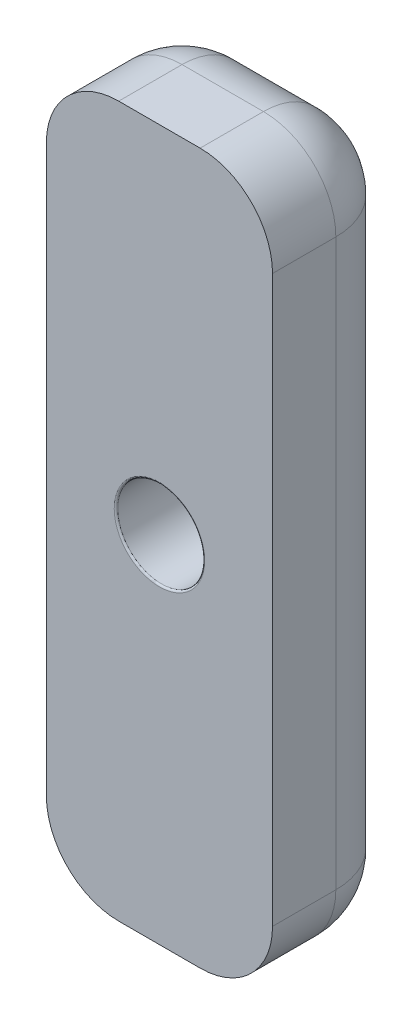
ISO-10303-21;
HEADER;
FILE_DESCRIPTION(('STEP AP214'),'2;1');
FILE_NAME('part.step','',(''),(''),'','','');
FILE_SCHEMA(('AUTOMOTIVE_DESIGN { 1 0 10303 214 1 1 1 1 }'));
ENDSEC;
DATA;
#1=APPLICATION_CONTEXT('core data for automotive mechanical design processes');
#2=APPLICATION_PROTOCOL_DEFINITION('international standard','automotive_design',2000,#1);
#3=PRODUCT_CONTEXT('',#1,'mechanical');
#4=PRODUCT('Part','Part','',(#3));
#5=PRODUCT_RELATED_PRODUCT_CATEGORY('part','',(#4));
#6=PRODUCT_DEFINITION_FORMATION('','',#4);
#7=PRODUCT_DEFINITION_CONTEXT('part definition',#1,'design');
#8=PRODUCT_DEFINITION('design','',#6,#7);
#9=PRODUCT_DEFINITION_SHAPE('','',#8);
#10=(LENGTH_UNIT() NAMED_UNIT(*) SI_UNIT(.MILLI.,.METRE.));
#11=(NAMED_UNIT(*) PLANE_ANGLE_UNIT() SI_UNIT($,.RADIAN.));
#12=(NAMED_UNIT(*) SI_UNIT($,.STERADIAN.) SOLID_ANGLE_UNIT());
#13=UNCERTAINTY_MEASURE_WITH_UNIT(LENGTH_MEASURE(1.E-05),#10,'distance_accuracy_value','');
#14=(GEOMETRIC_REPRESENTATION_CONTEXT(3) GLOBAL_UNCERTAINTY_ASSIGNED_CONTEXT((#13)) GLOBAL_UNIT_ASSIGNED_CONTEXT((#10,
#11,#12)) REPRESENTATION_CONTEXT('',''));
#15=CARTESIAN_POINT('',(0.,0.,0.));
#16=DIRECTION('',(0.,0.,1.));
#17=DIRECTION('',(1.,0.,0.));
#18=AXIS2_PLACEMENT_3D('',#15,#16,#17);
#19=CARTESIAN_POINT('',(12.5,39.25,15.));
#20=DIRECTION('',(0.,-1.,0.));
#21=DIRECTION('',(1.,0.,0.));
#22=AXIS2_PLACEMENT_3D('',#19,#20,#21);
#23=PLANE('',#22);
#24=DIRECTION('',(0.,0.,-1.));
#25=VECTOR('',#24,1.);
#26=CARTESIAN_POINT('',(4.5,39.25,15.));
#27=LINE('',#26,#25);
#28=CARTESIAN_POINT('',(4.5,39.25,15.));
#29=VERTEX_POINT('',#28);
#30=CARTESIAN_POINT('',(4.5,39.25,8.));
#31=VERTEX_POINT('',#30);
#32=EDGE_CURVE('E159',#29,#31,#27,.T.);
#33=ORIENTED_EDGE('',*,*,#32,.T.);
#34=DIRECTION('',(-1.,0.,0.));
#35=VECTOR('',#34,1.);
#36=CARTESIAN_POINT('',(-4.5,39.25,8.));
#37=LINE('',#36,#35);
#38=CARTESIAN_POINT('',(-4.5,39.25,8.));
#39=VERTEX_POINT('',#38);
#40=EDGE_CURVE('E180',#31,#39,#37,.T.);
#41=ORIENTED_EDGE('',*,*,#40,.T.);
#42=DIRECTION('',(0.,0.,-1.));
#43=VECTOR('',#42,1.);
#44=CARTESIAN_POINT('',(-4.5,39.25,15.));
#45=LINE('',#44,#43);
#46=CARTESIAN_POINT('',(-4.5,39.25,15.));
#47=VERTEX_POINT('',#46);
#48=EDGE_CURVE('E158',#39,#47,#45,.F.);
#49=ORIENTED_EDGE('',*,*,#48,.T.);
#50=DIRECTION('',(-1.,0.,0.));
#51=VECTOR('',#50,1.);
#52=CARTESIAN_POINT('',(12.5,39.25,15.));
#53=LINE('',#52,#51);
#54=EDGE_CURVE('E215',#29,#47,#53,.T.);
#55=ORIENTED_EDGE('',*,*,#54,.F.);
#56=EDGE_LOOP('',(#33,#41,#49,#55));
#57=FACE_BOUND('',#56,.T.);
#58=ADVANCED_FACE('F41',(#57),#23,.F.);
#59=CARTESIAN_POINT('',(-12.5,-39.25,15.));
#60=DIRECTION('',(1.,0.,0.));
#61=DIRECTION('',(0.,1.,0.));
#62=AXIS2_PLACEMENT_3D('',#59,#60,#61);
#63=PLANE('',#62);
#64=DIRECTION('',(0.,0.,-1.));
#65=VECTOR('',#64,1.);
#66=CARTESIAN_POINT('',(-12.5,31.25,15.));
#67=LINE('',#66,#65);
#68=CARTESIAN_POINT('',(-12.5,31.25,15.));
#69=VERTEX_POINT('',#68);
#70=CARTESIAN_POINT('',(-12.5,31.25,8.));
#71=VERTEX_POINT('',#70);
#72=EDGE_CURVE('E136',#69,#71,#67,.T.);
#73=ORIENTED_EDGE('',*,*,#72,.T.);
#74=DIRECTION('',(0.,-1.,0.));
#75=VECTOR('',#74,1.);
#76=CARTESIAN_POINT('',(-12.5,-31.25,8.));
#77=LINE('',#76,#75);
#78=CARTESIAN_POINT('',(-12.5,-31.25,8.));
#79=VERTEX_POINT('',#78);
#80=EDGE_CURVE('E64',#71,#79,#77,.T.);
#81=ORIENTED_EDGE('',*,*,#80,.T.);
#82=DIRECTION('',(0.,0.,-1.));
#83=VECTOR('',#82,1.);
#84=CARTESIAN_POINT('',(-12.5,-31.25,15.));
#85=LINE('',#84,#83);
#86=CARTESIAN_POINT('',(-12.5,-31.25,15.));
#87=VERTEX_POINT('',#86);
#88=EDGE_CURVE('E142',#79,#87,#85,.F.);
#89=ORIENTED_EDGE('',*,*,#88,.T.);
#90=DIRECTION('',(0.,-1.,0.));
#91=VECTOR('',#90,1.);
#92=CARTESIAN_POINT('',(-12.5,-39.25,15.));
#93=LINE('',#92,#91);
#94=EDGE_CURVE('E130',#69,#87,#93,.T.);
#95=ORIENTED_EDGE('',*,*,#94,.F.);
#96=EDGE_LOOP('',(#73,#81,#89,#95));
#97=FACE_BOUND('',#96,.T.);
#98=ADVANCED_FACE('F250',(#97),#63,.F.);
#99=CARTESIAN_POINT('',(12.5,-39.25,15.));
#100=DIRECTION('',(0.,1.,0.));
#101=DIRECTION('',(0.,0.,1.));
#102=AXIS2_PLACEMENT_3D('',#99,#100,#101);
#103=PLANE('',#102);
#104=DIRECTION('',(0.,0.,-1.));
#105=VECTOR('',#104,1.);
#106=CARTESIAN_POINT('',(-4.5,-39.25,15.));
#107=LINE('',#106,#105);
#108=CARTESIAN_POINT('',(-4.5,-39.25,15.));
#109=VERTEX_POINT('',#108);
#110=CARTESIAN_POINT('',(-4.5,-39.25,8.));
#111=VERTEX_POINT('',#110);
#112=EDGE_CURVE('E132',#109,#111,#107,.T.);
#113=ORIENTED_EDGE('',*,*,#112,.T.);
#114=DIRECTION('',(1.,0.,0.));
#115=VECTOR('',#114,1.);
#116=CARTESIAN_POINT('',(4.5,-39.25,8.));
#117=LINE('',#116,#115);
#118=CARTESIAN_POINT('',(4.5,-39.25,8.));
#119=VERTEX_POINT('',#118);
#120=EDGE_CURVE('E11',#111,#119,#117,.T.);
#121=ORIENTED_EDGE('',*,*,#120,.T.);
#122=DIRECTION('',(0.,0.,-1.));
#123=VECTOR('',#122,1.);
#124=CARTESIAN_POINT('',(4.5,-39.25,15.));
#125=LINE('',#124,#123);
#126=CARTESIAN_POINT('',(4.5,-39.25,15.));
#127=VERTEX_POINT('',#126);
#128=EDGE_CURVE('E138',#119,#127,#125,.F.);
#129=ORIENTED_EDGE('',*,*,#128,.T.);
#130=DIRECTION('',(1.,0.,0.));
#131=VECTOR('',#130,1.);
#132=CARTESIAN_POINT('',(12.5,-39.25,15.));
#133=LINE('',#132,#131);
#134=EDGE_CURVE('E125',#109,#127,#133,.T.);
#135=ORIENTED_EDGE('',*,*,#134,.F.);
#136=EDGE_LOOP('',(#113,#121,#129,#135));
#137=FACE_BOUND('',#136,.T.);
#138=ADVANCED_FACE('F135',(#137),#103,.F.);
#139=CARTESIAN_POINT('',(12.5,-39.25,15.));
#140=DIRECTION('',(-1.,0.,0.));
#141=DIRECTION('',(0.,-1.,0.));
#142=AXIS2_PLACEMENT_3D('',#139,#140,#141);
#143=PLANE('',#142);
#144=DIRECTION('',(0.,0.,-1.));
#145=VECTOR('',#144,1.);
#146=CARTESIAN_POINT('',(12.5,-31.25,15.));
#147=LINE('',#146,#145);
#148=CARTESIAN_POINT('',(12.5,-31.25,15.));
#149=VERTEX_POINT('',#148);
#150=CARTESIAN_POINT('',(12.5,-31.25,8.));
#151=VERTEX_POINT('',#150);
#152=EDGE_CURVE('E154',#149,#151,#147,.T.);
#153=ORIENTED_EDGE('',*,*,#152,.T.);
#154=DIRECTION('',(0.,1.,0.));
#155=VECTOR('',#154,1.);
#156=CARTESIAN_POINT('',(12.5,31.25,8.));
#157=LINE('',#156,#155);
#158=CARTESIAN_POINT('',(12.5,31.25,8.));
#159=VERTEX_POINT('',#158);
#160=EDGE_CURVE('E167',#151,#159,#157,.T.);
#161=ORIENTED_EDGE('',*,*,#160,.T.);
#162=DIRECTION('',(0.,0.,-1.));
#163=VECTOR('',#162,1.);
#164=CARTESIAN_POINT('',(12.5,31.25,15.));
#165=LINE('',#164,#163);
#166=CARTESIAN_POINT('',(12.5,31.25,15.));
#167=VERTEX_POINT('',#166);
#168=EDGE_CURVE('E126',#159,#167,#165,.F.);
#169=ORIENTED_EDGE('',*,*,#168,.T.);
#170=DIRECTION('',(0.,1.,0.));
#171=VECTOR('',#170,1.);
#172=CARTESIAN_POINT('',(12.5,-39.25,15.));
#173=LINE('',#172,#171);
#174=EDGE_CURVE('E139',#149,#167,#173,.T.);
#175=ORIENTED_EDGE('',*,*,#174,.F.);
#176=EDGE_LOOP('',(#153,#161,#169,#175));
#177=FACE_BOUND('',#176,.T.);
#178=ADVANCED_FACE('F316',(#177),#143,.F.);
#179=CARTESIAN_POINT('',(0.,0.,15.));
#180=DIRECTION('',(0.,0.,-1.));
#181=DIRECTION('',(-1.,0.,0.));
#182=AXIS2_PLACEMENT_3D('',#179,#180,#181);
#183=PLANE('',#182);
#184=CARTESIAN_POINT('',(0.,0.,15.));
#185=DIRECTION('',(0.,0.,-1.));
#186=DIRECTION('',(-1.,0.,0.));
#187=AXIS2_PLACEMENT_3D('',#184,#185,#186);
#188=CIRCLE('',#187,5.);
#189=CARTESIAN_POINT('',(-5.,0.,15.));
#190=VERTEX_POINT('',#189);
#191=EDGE_CURVE('E145',#190,#190,#188,.T.);
#192=ORIENTED_EDGE('',*,*,#191,.T.);
#193=EDGE_LOOP('',(#192));
#194=FACE_BOUND('',#193,.T.);
#195=ORIENTED_EDGE('',*,*,#94,.T.);
#196=CARTESIAN_POINT('',(-4.5,-31.25,15.));
#197=DIRECTION('',(0.,0.,-1.));
#198=DIRECTION('',(-1.,0.,0.));
#199=AXIS2_PLACEMENT_3D('',#196,#197,#198);
#200=CIRCLE('',#199,8.);
#201=EDGE_CURVE('E123',#87,#109,#200,.F.);
#202=ORIENTED_EDGE('',*,*,#201,.T.);
#203=ORIENTED_EDGE('',*,*,#134,.T.);
#204=CARTESIAN_POINT('',(4.5,-31.25,15.));
#205=DIRECTION('',(0.,0.,-1.));
#206=DIRECTION('',(-1.,0.,0.));
#207=AXIS2_PLACEMENT_3D('',#204,#205,#206);
#208=CIRCLE('',#207,8.);
#209=EDGE_CURVE('E129',#127,#149,#208,.F.);
#210=ORIENTED_EDGE('',*,*,#209,.T.);
#211=ORIENTED_EDGE('',*,*,#174,.T.);
#212=CARTESIAN_POINT('',(4.5,31.25,15.));
#213=DIRECTION('',(0.,0.,-1.));
#214=DIRECTION('',(-1.,0.,0.));
#215=AXIS2_PLACEMENT_3D('',#212,#213,#214);
#216=CIRCLE('',#215,8.);
#217=EDGE_CURVE('E151',#167,#29,#216,.F.);
#218=ORIENTED_EDGE('',*,*,#217,.T.);
#219=ORIENTED_EDGE('',*,*,#54,.T.);
#220=CARTESIAN_POINT('',(-4.5,31.25,15.));
#221=DIRECTION('',(0.,0.,-1.));
#222=DIRECTION('',(-1.,0.,0.));
#223=AXIS2_PLACEMENT_3D('',#220,#221,#222);
#224=CIRCLE('',#223,8.);
#225=EDGE_CURVE('E149',#47,#69,#224,.F.);
#226=ORIENTED_EDGE('',*,*,#225,.T.);
#227=EDGE_LOOP('',(#195,#202,#203,#210,#211,#218,#219,#226));
#228=FACE_BOUND('',#227,.T.);
#229=ADVANCED_FACE('F122',(#194,#228),#183,.F.);
#230=CARTESIAN_POINT('',(0.,0.,0.));
#231=DIRECTION('',(0.,0.,-1.));
#232=DIRECTION('',(-1.,0.,0.));
#233=AXIS2_PLACEMENT_3D('',#230,#231,#232);
#234=PLANE('',#233);
#235=DIRECTION('',(-1.,0.,0.));
#236=VECTOR('',#235,1.);
#237=CARTESIAN_POINT('',(4.5,31.25,0.));
#238=LINE('',#237,#236);
#239=CARTESIAN_POINT('',(-4.5,31.25,0.));
#240=VERTEX_POINT('',#239);
#241=CARTESIAN_POINT('',(4.5,31.25,0.));
#242=VERTEX_POINT('',#241);
#243=EDGE_CURVE('E175',#240,#242,#238,.F.);
#244=ORIENTED_EDGE('',*,*,#243,.T.);
#245=DIRECTION('',(0.,1.,0.));
#246=VECTOR('',#245,1.);
#247=CARTESIAN_POINT('',(4.5,-31.25,0.));
#248=LINE('',#247,#246);
#249=CARTESIAN_POINT('',(4.5,-31.25,0.));
#250=VERTEX_POINT('',#249);
#251=EDGE_CURVE('E173',#242,#250,#248,.F.);
#252=ORIENTED_EDGE('',*,*,#251,.T.);
#253=DIRECTION('',(1.,0.,0.));
#254=VECTOR('',#253,1.);
#255=CARTESIAN_POINT('',(-4.5,-31.25,0.));
#256=LINE('',#255,#254);
#257=CARTESIAN_POINT('',(-4.5,-31.25,0.));
#258=VERTEX_POINT('',#257);
#259=EDGE_CURVE('E169',#250,#258,#256,.F.);
#260=ORIENTED_EDGE('',*,*,#259,.T.);
#261=DIRECTION('',(0.,-1.,0.));
#262=VECTOR('',#261,1.);
#263=CARTESIAN_POINT('',(-4.5,31.25,0.));
#264=LINE('',#263,#262);
#265=EDGE_CURVE('E168',#258,#240,#264,.F.);
#266=ORIENTED_EDGE('',*,*,#265,.T.);
#267=EDGE_LOOP('',(#244,#252,#260,#266));
#268=FACE_BOUND('',#267,.T.);
#269=ADVANCED_FACE('F236',(#268),#234,.T.);
#270=CARTESIAN_POINT('',(0.,0.,2.));
#271=DIRECTION('',(0.,0.,1.));
#272=DIRECTION('',(1.,0.,0.));
#273=AXIS2_PLACEMENT_3D('',#270,#271,#272);
#274=CYLINDRICAL_SURFACE('',#273,4.8);
#275=CARTESIAN_POINT('',(0.,0.,14.8));
#276=DIRECTION('',(0.,0.,-1.));
#277=DIRECTION('',(-1.,0.,0.));
#278=AXIS2_PLACEMENT_3D('',#275,#276,#277);
#279=CIRCLE('',#278,4.8);
#280=CARTESIAN_POINT('',(4.8,0.,14.8));
#281=VERTEX_POINT('',#280);
#282=EDGE_CURVE('E225',#281,#281,#279,.F.);
#283=CARTESIAN_POINT('',(0.,0.,2.));
#284=DIRECTION('',(0.,0.,1.));
#285=DIRECTION('',(1.,0.,0.));
#286=AXIS2_PLACEMENT_3D('',#283,#284,#285);
#287=CIRCLE('',#286,4.8);
#288=CARTESIAN_POINT('',(4.8,0.,2.));
#289=VERTEX_POINT('',#288);
#290=EDGE_CURVE('E210',#289,#289,#287,.T.);
#291=CARTESIAN_POINT('',(4.8,0.,14.8));
#292=CARTESIAN_POINT('',(4.8,0.,14.6666666666667));
#293=CARTESIAN_POINT('',(4.8,0.,14.5333333333333));
#294=CARTESIAN_POINT('',(4.8,0.,14.2666666666667));
#295=CARTESIAN_POINT('',(4.8,0.,14.1333333333333));
#296=CARTESIAN_POINT('',(4.8,0.,13.8666666666667));
#297=CARTESIAN_POINT('',(4.8,0.,13.7333333333333));
#298=CARTESIAN_POINT('',(4.8,0.,13.4666666666667));
#299=CARTESIAN_POINT('',(4.8,0.,13.3333333333333));
#300=CARTESIAN_POINT('',(4.8,0.,13.0666666666667));
#301=CARTESIAN_POINT('',(4.8,0.,12.9333333333333));
#302=CARTESIAN_POINT('',(4.8,0.,12.6666666666667));
#303=CARTESIAN_POINT('',(4.8,0.,12.5333333333333));
#304=CARTESIAN_POINT('',(4.8,0.,12.2666666666667));
#305=CARTESIAN_POINT('',(4.8,0.,12.1333333333333));
#306=CARTESIAN_POINT('',(4.8,0.,11.8666666666667));
#307=CARTESIAN_POINT('',(4.8,0.,11.7333333333333));
#308=CARTESIAN_POINT('',(4.8,0.,11.4666666666667));
#309=CARTESIAN_POINT('',(4.8,0.,11.3333333333333));
#310=CARTESIAN_POINT('',(4.8,0.,11.0666666666667));
#311=CARTESIAN_POINT('',(4.8,0.,10.9333333333333));
#312=CARTESIAN_POINT('',(4.8,0.,10.6666666666667));
#313=CARTESIAN_POINT('',(4.8,0.,10.5333333333333));
#314=CARTESIAN_POINT('',(4.8,0.,10.2666666666667));
#315=CARTESIAN_POINT('',(4.8,0.,10.1333333333333));
#316=CARTESIAN_POINT('',(4.8,0.,9.86666666666667));
#317=CARTESIAN_POINT('',(4.8,0.,9.73333333333333));
#318=CARTESIAN_POINT('',(4.8,0.,9.46666666666667));
#319=CARTESIAN_POINT('',(4.8,0.,9.33333333333333));
#320=CARTESIAN_POINT('',(4.8,0.,9.06666666666667));
#321=CARTESIAN_POINT('',(4.8,0.,8.93333333333333));
#322=CARTESIAN_POINT('',(4.8,0.,8.66666666666667));
#323=CARTESIAN_POINT('',(4.8,0.,8.53333333333333));
#324=CARTESIAN_POINT('',(4.8,0.,8.26666666666667));
#325=CARTESIAN_POINT('',(4.8,0.,8.13333333333333));
#326=CARTESIAN_POINT('',(4.8,0.,7.86666666666667));
#327=CARTESIAN_POINT('',(4.8,0.,7.73333333333333));
#328=CARTESIAN_POINT('',(4.8,0.,7.46666666666667));
#329=CARTESIAN_POINT('',(4.8,0.,7.33333333333333));
#330=CARTESIAN_POINT('',(4.8,0.,7.06666666666667));
#331=CARTESIAN_POINT('',(4.8,0.,6.93333333333333));
#332=CARTESIAN_POINT('',(4.8,0.,6.66666666666667));
#333=CARTESIAN_POINT('',(4.8,0.,6.53333333333333));
#334=CARTESIAN_POINT('',(4.8,0.,6.26666666666667));
#335=CARTESIAN_POINT('',(4.8,0.,6.13333333333333));
#336=CARTESIAN_POINT('',(4.8,0.,5.86666666666667));
#337=CARTESIAN_POINT('',(4.8,0.,5.73333333333333));
#338=CARTESIAN_POINT('',(4.8,0.,5.46666666666667));
#339=CARTESIAN_POINT('',(4.8,0.,5.33333333333333));
#340=CARTESIAN_POINT('',(4.8,0.,5.06666666666667));
#341=CARTESIAN_POINT('',(4.8,0.,4.93333333333333));
#342=CARTESIAN_POINT('',(4.8,0.,4.66666666666667));
#343=CARTESIAN_POINT('',(4.8,0.,4.53333333333333));
#344=CARTESIAN_POINT('',(4.8,0.,4.26666666666667));
#345=CARTESIAN_POINT('',(4.8,0.,4.13333333333333));
#346=CARTESIAN_POINT('',(4.8,0.,3.86666666666667));
#347=CARTESIAN_POINT('',(4.8,0.,3.73333333333333));
#348=CARTESIAN_POINT('',(4.8,0.,3.46666666666667));
#349=CARTESIAN_POINT('',(4.8,0.,3.33333333333333));
#350=CARTESIAN_POINT('',(4.8,0.,3.06666666666667));
#351=CARTESIAN_POINT('',(4.8,0.,2.93333333333333));
#352=CARTESIAN_POINT('',(4.8,0.,2.66666666666667));
#353=CARTESIAN_POINT('',(4.8,0.,2.53333333333333));
#354=CARTESIAN_POINT('',(4.8,0.,2.26666666666667));
#355=CARTESIAN_POINT('',(4.8,0.,2.13333333333333));
#356=CARTESIAN_POINT('',(4.8,0.,2.));
#357=B_SPLINE_CURVE_WITH_KNOTS('',3,(#291,#292,#293,#294,#295,#296,#297,#298,#299,#300,#301,
#302,#303,#304,#305,#306,#307,#308,#309,#310,#311,#312,#313,#314,#315,#316,#317,#318,#319,#320,
#321,#322,#323,#324,#325,#326,#327,#328,#329,#330,#331,#332,#333,#334,#335,#336,#337,#338,#339,
#340,#341,#342,#343,#344,#345,#346,#347,#348,#349,#350,#351,#352,#353,#354,#355,#356),
.UNSPECIFIED.,.F.,.F.,(4,2,2,2,2,2,2,2,2,2,2,2,2,2,2,2,2,2,2,2,2,2,2,2,2,2,2,2,2,2,2,2,4),(0.,
0.399999999999999,0.8,1.2,1.6,2.,2.4,2.8,3.2,3.6,4.,4.4,4.8,5.2,5.6,6.,6.4,6.8,7.2,7.6,8.,8.4,
8.8,9.2,9.6,10.,10.4,10.8,11.2,11.6,12.,12.4,12.8),.UNSPECIFIED.);
#358=EDGE_CURVE('BSEAM231',#281,#289,#357,.T.);
#359=ORIENTED_EDGE('',*,*,#282,.T.);
#360=ORIENTED_EDGE('',*,*,#290,.F.);
#361=ORIENTED_EDGE('',*,*,#358,.T.);
#362=ORIENTED_EDGE('',*,*,#358,.F.);
#363=EDGE_LOOP('',(#359,#361,#360,#362));
#364=FACE_BOUND('',#363,.T.);
#365=ADVANCED_FACE('F231',(#364),#274,.F.);
#366=CARTESIAN_POINT('',(0.,0.,2.));
#367=DIRECTION('',(0.,0.,1.));
#368=DIRECTION('',(1.,0.,0.));
#369=AXIS2_PLACEMENT_3D('',#366,#367,#368);
#370=PLANE('',#369);
#371=ORIENTED_EDGE('',*,*,#290,.T.);
#372=EDGE_LOOP('',(#371));
#373=FACE_BOUND('',#372,.T.);
#374=ADVANCED_FACE('F233',(#373),#370,.T.);
#375=CARTESIAN_POINT('',(0.,0.,14.8));
#376=DIRECTION('',(0.,0.,-1.));
#377=DIRECTION('',(-1.,0.,0.));
#378=AXIS2_PLACEMENT_3D('',#375,#376,#377);
#379=TOROIDAL_SURFACE('',#378,5.,0.2);
#380=ORIENTED_EDGE('',*,*,#191,.F.);
#381=EDGE_LOOP('',(#380));
#382=FACE_BOUND('',#381,.T.);
#383=ORIENTED_EDGE('',*,*,#282,.F.);
#384=EDGE_LOOP('',(#383));
#385=FACE_BOUND('',#384,.T.);
#386=ADVANCED_FACE('F227',(#382,#385),#379,.T.);
#387=CARTESIAN_POINT('',(-4.5,-31.25,15.));
#388=DIRECTION('',(0.,0.,-1.));
#389=DIRECTION('',(-1.,0.,0.));
#390=AXIS2_PLACEMENT_3D('',#387,#388,#389);
#391=CYLINDRICAL_SURFACE('',#390,8.);
#392=ORIENTED_EDGE('',*,*,#88,.F.);
#393=CARTESIAN_POINT('',(-4.5,-31.25,8.));
#394=DIRECTION('',(0.,0.,-1.));
#395=DIRECTION('',(-1.,0.,0.));
#396=AXIS2_PLACEMENT_3D('',#393,#394,#395);
#397=CIRCLE('',#396,8.);
#398=EDGE_CURVE('E49',#79,#111,#397,.F.);
#399=ORIENTED_EDGE('',*,*,#398,.T.);
#400=ORIENTED_EDGE('',*,*,#112,.F.);
#401=ORIENTED_EDGE('',*,*,#201,.F.);
#402=EDGE_LOOP('',(#392,#399,#400,#401));
#403=FACE_BOUND('',#402,.T.);
#404=ADVANCED_FACE('F140',(#403),#391,.T.);
#405=CARTESIAN_POINT('',(4.5,-31.25,15.));
#406=DIRECTION('',(0.,0.,-1.));
#407=DIRECTION('',(-1.,0.,0.));
#408=AXIS2_PLACEMENT_3D('',#405,#406,#407);
#409=CYLINDRICAL_SURFACE('',#408,8.);
#410=ORIENTED_EDGE('',*,*,#128,.F.);
#411=CARTESIAN_POINT('',(4.5,-31.25,8.));
#412=DIRECTION('',(0.,0.,-1.));
#413=DIRECTION('',(-1.,0.,0.));
#414=AXIS2_PLACEMENT_3D('',#411,#412,#413);
#415=CIRCLE('',#414,8.);
#416=EDGE_CURVE('E162',#119,#151,#415,.F.);
#417=ORIENTED_EDGE('',*,*,#416,.T.);
#418=ORIENTED_EDGE('',*,*,#152,.F.);
#419=ORIENTED_EDGE('',*,*,#209,.F.);
#420=EDGE_LOOP('',(#410,#417,#418,#419));
#421=FACE_BOUND('',#420,.T.);
#422=ADVANCED_FACE('F261',(#421),#409,.T.);
#423=CARTESIAN_POINT('',(4.5,31.25,15.));
#424=DIRECTION('',(0.,0.,-1.));
#425=DIRECTION('',(-1.,0.,0.));
#426=AXIS2_PLACEMENT_3D('',#423,#424,#425);
#427=CYLINDRICAL_SURFACE('',#426,8.);
#428=ORIENTED_EDGE('',*,*,#168,.F.);
#429=CARTESIAN_POINT('',(4.5,31.25,8.));
#430=DIRECTION('',(0.,0.,-1.));
#431=DIRECTION('',(-1.,0.,0.));
#432=AXIS2_PLACEMENT_3D('',#429,#430,#431);
#433=CIRCLE('',#432,8.);
#434=EDGE_CURVE('E179',#159,#31,#433,.F.);
#435=ORIENTED_EDGE('',*,*,#434,.T.);
#436=ORIENTED_EDGE('',*,*,#32,.F.);
#437=ORIENTED_EDGE('',*,*,#217,.F.);
#438=EDGE_LOOP('',(#428,#435,#436,#437));
#439=FACE_BOUND('',#438,.T.);
#440=ADVANCED_FACE('F262',(#439),#427,.T.);
#441=CARTESIAN_POINT('',(-4.5,31.25,15.));
#442=DIRECTION('',(0.,0.,-1.));
#443=DIRECTION('',(-1.,0.,0.));
#444=AXIS2_PLACEMENT_3D('',#441,#442,#443);
#445=CYLINDRICAL_SURFACE('',#444,8.);
#446=ORIENTED_EDGE('',*,*,#48,.F.);
#447=CARTESIAN_POINT('',(-4.5,31.25,8.));
#448=DIRECTION('',(0.,0.,-1.));
#449=DIRECTION('',(-1.,0.,0.));
#450=AXIS2_PLACEMENT_3D('',#447,#448,#449);
#451=CIRCLE('',#450,8.);
#452=EDGE_CURVE('E182',#39,#71,#451,.F.);
#453=ORIENTED_EDGE('',*,*,#452,.T.);
#454=ORIENTED_EDGE('',*,*,#72,.F.);
#455=ORIENTED_EDGE('',*,*,#225,.F.);
#456=EDGE_LOOP('',(#446,#453,#454,#455));
#457=FACE_BOUND('',#456,.T.);
#458=ADVANCED_FACE('F268',(#457),#445,.T.);
#459=CARTESIAN_POINT('',(-4.5,31.25,8.));
#460=DIRECTION('',(0.,0.,-1.));
#461=DIRECTION('',(-1.,0.,0.));
#462=AXIS2_PLACEMENT_3D('',#459,#460,#461);
#463=SPHERICAL_SURFACE('',#462,8.);
#464=CARTESIAN_POINT('',(-4.5,31.25,8.));
#465=DIRECTION('',(0.,-1.,0.));
#466=DIRECTION('',(0.,0.,-1.));
#467=AXIS2_PLACEMENT_3D('',#464,#465,#466);
#468=CIRCLE('',#467,8.);
#469=EDGE_CURVE('E199',#71,#240,#468,.T.);
#470=ORIENTED_EDGE('',*,*,#469,.F.);
#471=ORIENTED_EDGE('',*,*,#452,.F.);
#472=CARTESIAN_POINT('',(-4.5,31.25,8.));
#473=DIRECTION('',(1.,0.,0.));
#474=DIRECTION('',(0.,1.,0.));
#475=AXIS2_PLACEMENT_3D('',#472,#473,#474);
#476=CIRCLE('',#475,8.);
#477=EDGE_CURVE('E44',#240,#39,#476,.T.);
#478=ORIENTED_EDGE('',*,*,#477,.F.);
#479=EDGE_LOOP('',(#470,#471,#478));
#480=FACE_BOUND('',#479,.T.);
#481=ADVANCED_FACE('F43',(#480),#463,.T.);
#482=CARTESIAN_POINT('',(12.5,31.25,8.));
#483=DIRECTION('',(1.,0.,0.));
#484=DIRECTION('',(0.,1.,0.));
#485=AXIS2_PLACEMENT_3D('',#482,#483,#484);
#486=CYLINDRICAL_SURFACE('',#485,8.);
#487=ORIENTED_EDGE('',*,*,#477,.T.);
#488=ORIENTED_EDGE('',*,*,#40,.F.);
#489=CARTESIAN_POINT('',(4.5,31.25,8.));
#490=DIRECTION('',(1.,0.,0.));
#491=DIRECTION('',(0.,1.,0.));
#492=AXIS2_PLACEMENT_3D('',#489,#490,#491);
#493=CIRCLE('',#492,8.);
#494=EDGE_CURVE('E196',#242,#31,#493,.T.);
#495=ORIENTED_EDGE('',*,*,#494,.F.);
#496=ORIENTED_EDGE('',*,*,#243,.F.);
#497=EDGE_LOOP('',(#487,#488,#495,#496));
#498=FACE_BOUND('',#497,.T.);
#499=ADVANCED_FACE('F293',(#498),#486,.T.);
#500=CARTESIAN_POINT('',(-4.5,-39.25,8.));
#501=DIRECTION('',(0.,1.,0.));
#502=DIRECTION('',(-1.,0.,0.));
#503=AXIS2_PLACEMENT_3D('',#500,#501,#502);
#504=CYLINDRICAL_SURFACE('',#503,8.);
#505=ORIENTED_EDGE('',*,*,#469,.T.);
#506=ORIENTED_EDGE('',*,*,#265,.F.);
#507=CARTESIAN_POINT('',(-4.5,-31.25,8.));
#508=DIRECTION('',(0.,-1.,0.));
#509=DIRECTION('',(0.,0.,-1.));
#510=AXIS2_PLACEMENT_3D('',#507,#508,#509);
#511=CIRCLE('',#510,8.);
#512=EDGE_CURVE('E191',#79,#258,#511,.T.);
#513=ORIENTED_EDGE('',*,*,#512,.F.);
#514=ORIENTED_EDGE('',*,*,#80,.F.);
#515=EDGE_LOOP('',(#505,#506,#513,#514));
#516=FACE_BOUND('',#515,.T.);
#517=ADVANCED_FACE('F295',(#516),#504,.T.);
#518=CARTESIAN_POINT('',(4.5,31.25,8.));
#519=DIRECTION('',(0.,0.,-1.));
#520=DIRECTION('',(-1.,0.,0.));
#521=AXIS2_PLACEMENT_3D('',#518,#519,#520);
#522=SPHERICAL_SURFACE('',#521,8.);
#523=ORIENTED_EDGE('',*,*,#494,.T.);
#524=ORIENTED_EDGE('',*,*,#434,.F.);
#525=CARTESIAN_POINT('',(4.5,31.25,8.));
#526=DIRECTION('',(0.,-1.,0.));
#527=DIRECTION('',(1.,0.,0.));
#528=AXIS2_PLACEMENT_3D('',#525,#526,#527);
#529=CIRCLE('',#528,8.);
#530=EDGE_CURVE('E194',#242,#159,#529,.T.);
#531=ORIENTED_EDGE('',*,*,#530,.F.);
#532=EDGE_LOOP('',(#523,#524,#531));
#533=FACE_BOUND('',#532,.T.);
#534=ADVANCED_FACE('F287',(#533),#522,.T.);
#535=CARTESIAN_POINT('',(-4.5,-31.25,8.));
#536=DIRECTION('',(0.,0.,-1.));
#537=DIRECTION('',(-1.,0.,0.));
#538=AXIS2_PLACEMENT_3D('',#535,#536,#537);
#539=SPHERICAL_SURFACE('',#538,8.);
#540=ORIENTED_EDGE('',*,*,#398,.F.);
#541=ORIENTED_EDGE('',*,*,#512,.T.);
#542=CARTESIAN_POINT('',(-4.5,-31.25,8.));
#543=DIRECTION('',(1.,0.,0.));
#544=DIRECTION('',(0.,0.,-1.));
#545=AXIS2_PLACEMENT_3D('',#542,#543,#544);
#546=CIRCLE('',#545,8.);
#547=EDGE_CURVE('E188',#111,#258,#546,.T.);
#548=ORIENTED_EDGE('',*,*,#547,.F.);
#549=EDGE_LOOP('',(#540,#541,#548));
#550=FACE_BOUND('',#549,.T.);
#551=ADVANCED_FACE('F283',(#550),#539,.T.);
#552=CARTESIAN_POINT('',(4.5,-39.25,8.));
#553=DIRECTION('',(0.,-1.,0.));
#554=DIRECTION('',(1.,0.,0.));
#555=AXIS2_PLACEMENT_3D('',#552,#553,#554);
#556=CYLINDRICAL_SURFACE('',#555,8.);
#557=ORIENTED_EDGE('',*,*,#530,.T.);
#558=ORIENTED_EDGE('',*,*,#160,.F.);
#559=CARTESIAN_POINT('',(4.5,-31.25,8.));
#560=DIRECTION('',(0.,-1.,0.));
#561=DIRECTION('',(0.,0.,-1.));
#562=AXIS2_PLACEMENT_3D('',#559,#560,#561);
#563=CIRCLE('',#562,8.);
#564=EDGE_CURVE('E190',#250,#151,#563,.T.);
#565=ORIENTED_EDGE('',*,*,#564,.F.);
#566=ORIENTED_EDGE('',*,*,#251,.F.);
#567=EDGE_LOOP('',(#557,#558,#565,#566));
#568=FACE_BOUND('',#567,.T.);
#569=ADVANCED_FACE('F278',(#568),#556,.T.);
#570=CARTESIAN_POINT('',(12.5,-31.25,8.));
#571=DIRECTION('',(-1.,0.,0.));
#572=DIRECTION('',(0.,0.,1.));
#573=AXIS2_PLACEMENT_3D('',#570,#571,#572);
#574=CYLINDRICAL_SURFACE('',#573,8.);
#575=ORIENTED_EDGE('',*,*,#547,.T.);
#576=ORIENTED_EDGE('',*,*,#259,.F.);
#577=CARTESIAN_POINT('',(4.5,-31.25,8.));
#578=DIRECTION('',(1.,0.,0.));
#579=DIRECTION('',(0.,0.,-1.));
#580=AXIS2_PLACEMENT_3D('',#577,#578,#579);
#581=CIRCLE('',#580,8.);
#582=EDGE_CURVE('E183',#119,#250,#581,.T.);
#583=ORIENTED_EDGE('',*,*,#582,.F.);
#584=ORIENTED_EDGE('',*,*,#120,.F.);
#585=EDGE_LOOP('',(#575,#576,#583,#584));
#586=FACE_BOUND('',#585,.T.);
#587=ADVANCED_FACE('F277',(#586),#574,.T.);
#588=CARTESIAN_POINT('',(4.5,-31.25,8.));
#589=DIRECTION('',(0.,0.,-1.));
#590=DIRECTION('',(-1.,0.,0.));
#591=AXIS2_PLACEMENT_3D('',#588,#589,#590);
#592=SPHERICAL_SURFACE('',#591,8.);
#593=ORIENTED_EDGE('',*,*,#564,.T.);
#594=ORIENTED_EDGE('',*,*,#416,.F.);
#595=ORIENTED_EDGE('',*,*,#582,.T.);
#596=EDGE_LOOP('',(#593,#594,#595));
#597=FACE_BOUND('',#596,.T.);
#598=ADVANCED_FACE('F272',(#597),#592,.T.);
#599=CLOSED_SHELL('',(#58,#98,#138,#178,#229,#269,#365,#374,#386,#404,#422,#440,#458,#481,#499,
#517,#534,#551,#569,#587,#598));
#600=MANIFOLD_SOLID_BREP('B2',#599);
#601=ADVANCED_BREP_SHAPE_REPRESENTATION('',(#18,#600),#14);
#602=SHAPE_DEFINITION_REPRESENTATION(#9,#601);
ENDSEC;
END-ISO-10303-21;
